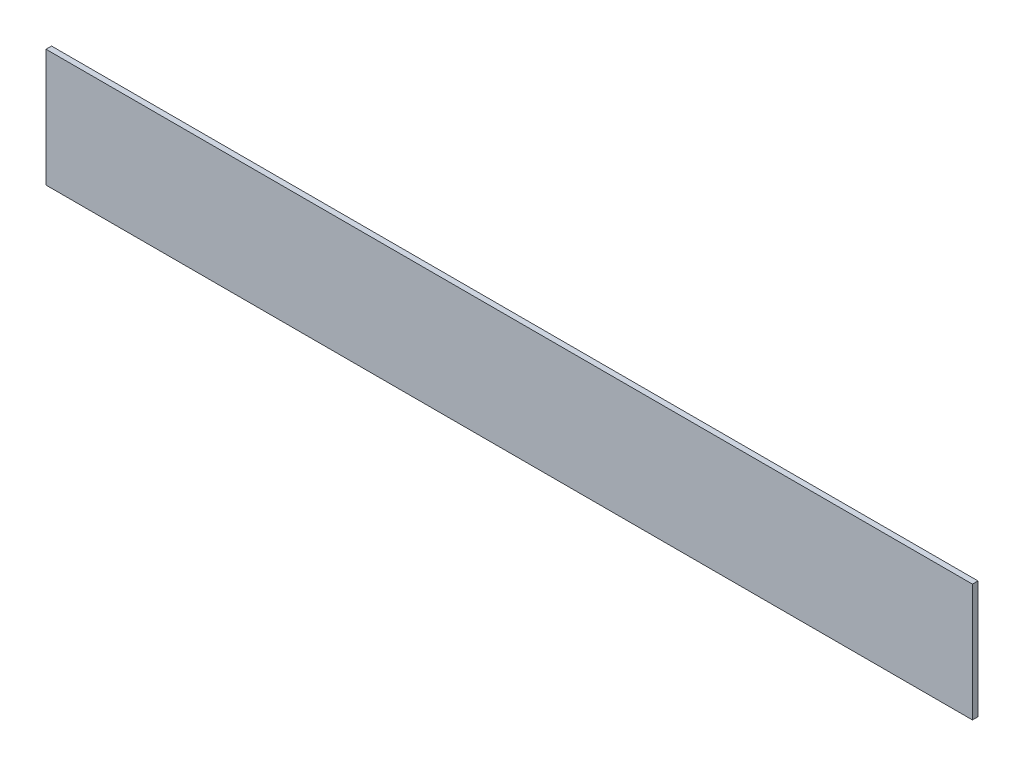
ISO-10303-21;
HEADER;
FILE_DESCRIPTION(('STEP AP214'),'2;1');
FILE_NAME('part.step','',(''),(''),'','','');
FILE_SCHEMA(('AUTOMOTIVE_DESIGN { 1 0 10303 214 1 1 1 1 }'));
ENDSEC;
DATA;
#1=APPLICATION_CONTEXT('core data for automotive mechanical design processes');
#2=APPLICATION_PROTOCOL_DEFINITION('international standard','automotive_design',2000,#1);
#3=PRODUCT_CONTEXT('',#1,'mechanical');
#4=PRODUCT('Part','Part','',(#3));
#5=PRODUCT_RELATED_PRODUCT_CATEGORY('part','',(#4));
#6=PRODUCT_DEFINITION_FORMATION('','',#4);
#7=PRODUCT_DEFINITION_CONTEXT('part definition',#1,'design');
#8=PRODUCT_DEFINITION('design','',#6,#7);
#9=PRODUCT_DEFINITION_SHAPE('','',#8);
#10=(LENGTH_UNIT() NAMED_UNIT(*) SI_UNIT(.MILLI.,.METRE.));
#11=(NAMED_UNIT(*) PLANE_ANGLE_UNIT() SI_UNIT($,.RADIAN.));
#12=(NAMED_UNIT(*) SI_UNIT($,.STERADIAN.) SOLID_ANGLE_UNIT());
#13=UNCERTAINTY_MEASURE_WITH_UNIT(LENGTH_MEASURE(1.E-05),#10,'distance_accuracy_value','');
#14=(GEOMETRIC_REPRESENTATION_CONTEXT(3) GLOBAL_UNCERTAINTY_ASSIGNED_CONTEXT((#13)) GLOBAL_UNIT_ASSIGNED_CONTEXT((#10,
#11,#12)) REPRESENTATION_CONTEXT('',''));
#15=CARTESIAN_POINT('',(0.,0.,0.));
#16=DIRECTION('',(0.,0.,1.));
#17=DIRECTION('',(1.,0.,0.));
#18=AXIS2_PLACEMENT_3D('',#15,#16,#17);
#19=CARTESIAN_POINT('',(-52.7884738485174,17.1339563862928,0.6));
#20=DIRECTION('',(1.,0.,0.));
#21=DIRECTION('',(0.,1.,0.));
#22=AXIS2_PLACEMENT_3D('',#19,#20,#21);
#23=PLANE('',#22);
#24=DIRECTION('',(0.,-1.,0.));
#25=VECTOR('',#24,1.);
#26=CARTESIAN_POINT('',(-52.7884738485174,17.1339563862928,0.));
#27=LINE('',#26,#25);
#28=CARTESIAN_POINT('',(-52.7884738485174,17.1339563862928,0.));
#29=VERTEX_POINT('',#28);
#30=CARTESIAN_POINT('',(-52.7884738485174,4.4339563862921,0.));
#31=VERTEX_POINT('',#30);
#32=EDGE_CURVE('E87',#29,#31,#27,.T.);
#33=ORIENTED_EDGE('',*,*,#32,.T.);
#34=DIRECTION('',(0.,0.,1.));
#35=VECTOR('',#34,1.);
#36=CARTESIAN_POINT('',(-52.7884738485174,4.4339563862921,0.6));
#37=LINE('',#36,#35);
#38=CARTESIAN_POINT('',(-52.7884738485174,4.4339563862921,0.6));
#39=VERTEX_POINT('',#38);
#40=EDGE_CURVE('E53',#31,#39,#37,.T.);
#41=ORIENTED_EDGE('',*,*,#40,.T.);
#42=DIRECTION('',(0.,-1.,0.));
#43=VECTOR('',#42,1.);
#44=CARTESIAN_POINT('',(-52.7884738485174,17.1339563862928,0.6));
#45=LINE('',#44,#43);
#46=CARTESIAN_POINT('',(-52.7884738485174,17.1339563862928,0.6));
#47=VERTEX_POINT('',#46);
#48=EDGE_CURVE('E82',#47,#39,#45,.T.);
#49=ORIENTED_EDGE('',*,*,#48,.F.);
#50=DIRECTION('',(0.,0.,-1.));
#51=VECTOR('',#50,1.);
#52=CARTESIAN_POINT('',(-52.7884738485174,17.1339563862928,0.6));
#53=LINE('',#52,#51);
#54=EDGE_CURVE('E46',#47,#29,#53,.T.);
#55=ORIENTED_EDGE('',*,*,#54,.T.);
#56=EDGE_LOOP('',(#33,#41,#49,#55));
#57=FACE_BOUND('',#56,.T.);
#58=ADVANCED_FACE('F39',(#57),#23,.F.);
#59=CARTESIAN_POINT('',(47.2115261514826,17.1339563862928,0.6));
#60=DIRECTION('',(-1.,0.,0.));
#61=DIRECTION('',(0.,0.,1.));
#62=AXIS2_PLACEMENT_3D('',#59,#60,#61);
#63=PLANE('',#62);
#64=DIRECTION('',(0.,1.,0.));
#65=VECTOR('',#64,1.);
#66=CARTESIAN_POINT('',(47.2115261514826,17.1339563862928,0.6));
#67=LINE('',#66,#65);
#68=CARTESIAN_POINT('',(47.2115261514826,4.4339563862921,0.6));
#69=VERTEX_POINT('',#68);
#70=CARTESIAN_POINT('',(47.2115261514826,17.1339563862928,0.6));
#71=VERTEX_POINT('',#70);
#72=EDGE_CURVE('E96',#69,#71,#67,.T.);
#73=ORIENTED_EDGE('',*,*,#72,.F.);
#74=DIRECTION('',(0.,0.,-1.));
#75=VECTOR('',#74,1.);
#76=CARTESIAN_POINT('',(47.2115261514826,4.4339563862921,0.6));
#77=LINE('',#76,#75);
#78=CARTESIAN_POINT('',(47.2115261514826,4.4339563862921,0.));
#79=VERTEX_POINT('',#78);
#80=EDGE_CURVE('E92',#69,#79,#77,.T.);
#81=ORIENTED_EDGE('',*,*,#80,.T.);
#82=DIRECTION('',(0.,1.,0.));
#83=VECTOR('',#82,1.);
#84=CARTESIAN_POINT('',(47.2115261514826,17.1339563862928,0.));
#85=LINE('',#84,#83);
#86=CARTESIAN_POINT('',(47.2115261514826,17.1339563862928,0.));
#87=VERTEX_POINT('',#86);
#88=EDGE_CURVE('E83',#79,#87,#85,.T.);
#89=ORIENTED_EDGE('',*,*,#88,.T.);
#90=DIRECTION('',(0.,0.,-1.));
#91=VECTOR('',#90,1.);
#92=CARTESIAN_POINT('',(47.2115261514826,17.1339563862928,0.6));
#93=LINE('',#92,#91);
#94=EDGE_CURVE('E11',#71,#87,#93,.T.);
#95=ORIENTED_EDGE('',*,*,#94,.F.);
#96=EDGE_LOOP('',(#73,#81,#89,#95));
#97=FACE_BOUND('',#96,.T.);
#98=ADVANCED_FACE('F111',(#97),#63,.F.);
#99=CARTESIAN_POINT('',(-52.7884738485174,17.1339563862928,0.6));
#100=DIRECTION('',(0.,-1.,0.));
#101=DIRECTION('',(0.,0.,-1.));
#102=AXIS2_PLACEMENT_3D('',#99,#100,#101);
#103=PLANE('',#102);
#104=DIRECTION('',(-1.,0.,0.));
#105=VECTOR('',#104,1.);
#106=CARTESIAN_POINT('',(-52.7884738485174,17.1339563862928,0.));
#107=LINE('',#106,#105);
#108=EDGE_CURVE('E74',#87,#29,#107,.T.);
#109=ORIENTED_EDGE('',*,*,#108,.T.);
#110=ORIENTED_EDGE('',*,*,#54,.F.);
#111=DIRECTION('',(-1.,0.,0.));
#112=VECTOR('',#111,1.);
#113=CARTESIAN_POINT('',(-52.7884738485174,17.1339563862928,0.6));
#114=LINE('',#113,#112);
#115=EDGE_CURVE('E62',#71,#47,#114,.T.);
#116=ORIENTED_EDGE('',*,*,#115,.F.);
#117=ORIENTED_EDGE('',*,*,#94,.T.);
#118=EDGE_LOOP('',(#109,#110,#116,#117));
#119=FACE_BOUND('',#118,.T.);
#120=ADVANCED_FACE('F76',(#119),#103,.F.);
#121=CARTESIAN_POINT('',(0.,0.,0.6));
#122=DIRECTION('',(0.,0.,1.));
#123=DIRECTION('',(1.,0.,0.));
#124=AXIS2_PLACEMENT_3D('',#121,#122,#123);
#125=PLANE('',#124);
#126=DIRECTION('',(-1.,0.,0.));
#127=VECTOR('',#126,1.);
#128=CARTESIAN_POINT('',(0.,4.4339563862921,0.6));
#129=LINE('',#128,#127);
#130=EDGE_CURVE('E101',#69,#39,#129,.T.);
#131=ORIENTED_EDGE('',*,*,#130,.F.);
#132=ORIENTED_EDGE('',*,*,#72,.T.);
#133=ORIENTED_EDGE('',*,*,#115,.T.);
#134=ORIENTED_EDGE('',*,*,#48,.T.);
#135=EDGE_LOOP('',(#131,#132,#133,#134));
#136=FACE_BOUND('',#135,.T.);
#137=ADVANCED_FACE('F113',(#136),#125,.T.);
#138=CARTESIAN_POINT('',(0.,0.,0.));
#139=DIRECTION('',(0.,0.,1.));
#140=DIRECTION('',(1.,0.,0.));
#141=AXIS2_PLACEMENT_3D('',#138,#139,#140);
#142=PLANE('',#141);
#143=ORIENTED_EDGE('',*,*,#88,.F.);
#144=DIRECTION('',(1.,0.,0.));
#145=VECTOR('',#144,1.);
#146=CARTESIAN_POINT('',(53.1715854748845,4.4339563862921,0.));
#147=LINE('',#146,#145);
#148=EDGE_CURVE('E89',#31,#79,#147,.T.);
#149=ORIENTED_EDGE('',*,*,#148,.F.);
#150=ORIENTED_EDGE('',*,*,#32,.F.);
#151=ORIENTED_EDGE('',*,*,#108,.F.);
#152=EDGE_LOOP('',(#143,#149,#150,#151));
#153=FACE_BOUND('',#152,.T.);
#154=ADVANCED_FACE('F88',(#153),#142,.F.);
#155=CARTESIAN_POINT('',(53.1715854748845,4.4339563862921,100.));
#156=DIRECTION('',(0.,1.,0.));
#157=DIRECTION('',(0.,0.,1.));
#158=AXIS2_PLACEMENT_3D('',#155,#156,#157);
#159=PLANE('',#158);
#160=ORIENTED_EDGE('',*,*,#148,.T.);
#161=ORIENTED_EDGE('',*,*,#80,.F.);
#162=ORIENTED_EDGE('',*,*,#130,.T.);
#163=ORIENTED_EDGE('',*,*,#40,.F.);
#164=EDGE_LOOP('',(#160,#161,#162,#163));
#165=FACE_BOUND('',#164,.T.);
#166=ADVANCED_FACE('F105',(#165),#159,.F.);
#167=CLOSED_SHELL('',(#58,#98,#120,#137,#154,#166));
#168=MANIFOLD_SOLID_BREP('B2',#167);
#169=ADVANCED_BREP_SHAPE_REPRESENTATION('',(#18,#168),#14);
#170=SHAPE_DEFINITION_REPRESENTATION(#9,#169);
ENDSEC;
END-ISO-10303-21;
